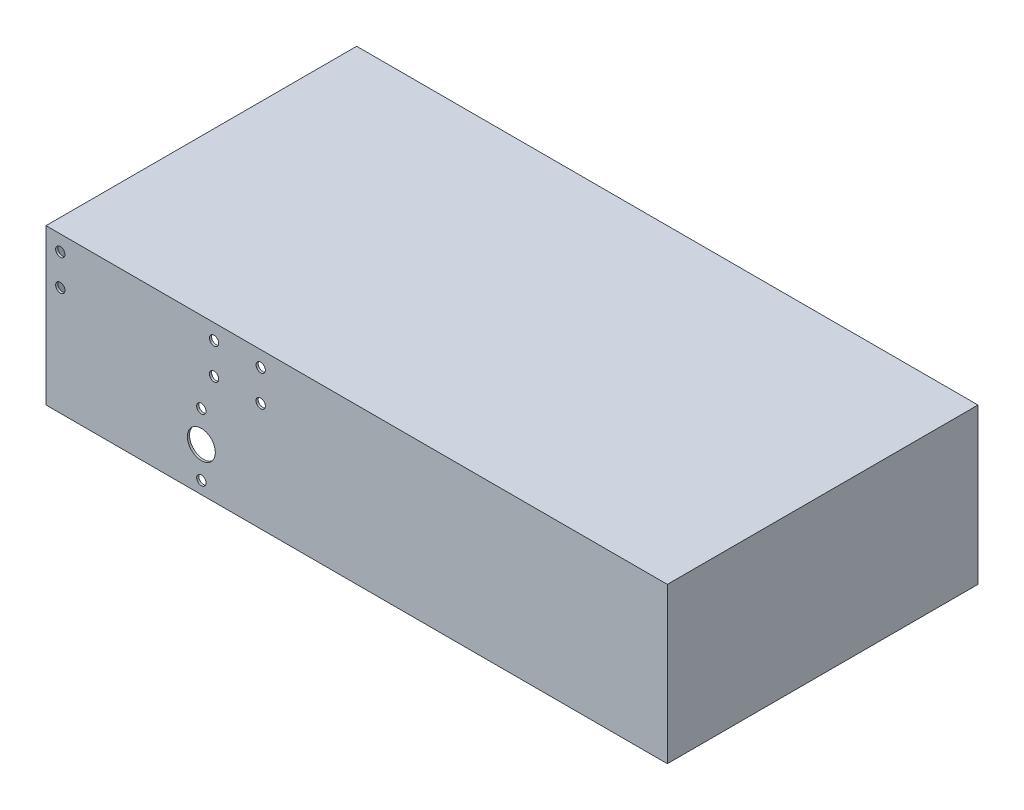
ISO-10303-21;
HEADER;
FILE_DESCRIPTION(('STEP AP214'),'2;1');
FILE_NAME('part.step','',(''),(''),'','','');
FILE_SCHEMA(('AUTOMOTIVE_DESIGN { 1 0 10303 214 1 1 1 1 }'));
ENDSEC;
DATA;
#1=APPLICATION_CONTEXT('core data for automotive mechanical design processes');
#2=APPLICATION_PROTOCOL_DEFINITION('international standard','automotive_design',2000,#1);
#3=PRODUCT_CONTEXT('',#1,'mechanical');
#4=PRODUCT('Part','Part','',(#3));
#5=PRODUCT_RELATED_PRODUCT_CATEGORY('part','',(#4));
#6=PRODUCT_DEFINITION_FORMATION('','',#4);
#7=PRODUCT_DEFINITION_CONTEXT('part definition',#1,'design');
#8=PRODUCT_DEFINITION('design','',#6,#7);
#9=PRODUCT_DEFINITION_SHAPE('','',#8);
#10=(LENGTH_UNIT() NAMED_UNIT(*) SI_UNIT(.MILLI.,.METRE.));
#11=(NAMED_UNIT(*) PLANE_ANGLE_UNIT() SI_UNIT($,.RADIAN.));
#12=(NAMED_UNIT(*) SI_UNIT($,.STERADIAN.) SOLID_ANGLE_UNIT());
#13=UNCERTAINTY_MEASURE_WITH_UNIT(LENGTH_MEASURE(1.E-05),#10,'distance_accuracy_value','');
#14=(GEOMETRIC_REPRESENTATION_CONTEXT(3) GLOBAL_UNCERTAINTY_ASSIGNED_CONTEXT((#13)) GLOBAL_UNIT_ASSIGNED_CONTEXT((#10,
#11,#12)) REPRESENTATION_CONTEXT('',''));
#15=CARTESIAN_POINT('',(0.,0.,0.));
#16=DIRECTION('',(0.,0.,1.));
#17=DIRECTION('',(1.,0.,0.));
#18=AXIS2_PLACEMENT_3D('',#15,#16,#17);
#19=CARTESIAN_POINT('',(0.,50.,-50.));
#20=DIRECTION('',(1.,0.,0.));
#21=DIRECTION('',(0.,0.,-1.));
#22=AXIS2_PLACEMENT_3D('',#19,#20,#21);
#23=PLANE('',#22);
#24=CARTESIAN_POINT('',(0.,45.,42.));
#25=DIRECTION('',(-1.,0.,0.));
#26=DIRECTION('',(0.,0.,1.));
#27=AXIS2_PLACEMENT_3D('',#24,#25,#26);
#28=CIRCLE('',#27,1.5);
#29=CARTESIAN_POINT('',(0.,45.,43.5));
#30=VERTEX_POINT('',#29);
#31=EDGE_CURVE('E293',#30,#30,#28,.T.);
#32=ORIENTED_EDGE('',*,*,#31,.F.);
#33=EDGE_LOOP('',(#32));
#34=FACE_BOUND('',#33,.T.);
#35=CARTESIAN_POINT('',(0.,35.,42.));
#36=DIRECTION('',(-1.,0.,0.));
#37=DIRECTION('',(0.,0.,1.));
#38=AXIS2_PLACEMENT_3D('',#35,#36,#37);
#39=CIRCLE('',#38,1.5);
#40=CARTESIAN_POINT('',(0.,35.,43.5));
#41=VERTEX_POINT('',#40);
#42=EDGE_CURVE('E297',#41,#41,#39,.T.);
#43=ORIENTED_EDGE('',*,*,#42,.F.);
#44=EDGE_LOOP('',(#43));
#45=FACE_BOUND('',#44,.T.);
#46=DIRECTION('',(0.,0.,1.));
#47=VECTOR('',#46,1.);
#48=CARTESIAN_POINT('',(0.,0.,-50.));
#49=LINE('',#48,#47);
#50=CARTESIAN_POINT('',(0.,0.,-50.));
#51=VERTEX_POINT('',#50);
#52=CARTESIAN_POINT('',(0.,0.,50.));
#53=VERTEX_POINT('',#52);
#54=EDGE_CURVE('E193',#51,#53,#49,.T.);
#55=ORIENTED_EDGE('',*,*,#54,.T.);
#56=DIRECTION('',(0.,-1.,0.));
#57=VECTOR('',#56,1.);
#58=CARTESIAN_POINT('',(0.,50.,50.));
#59=LINE('',#58,#57);
#60=CARTESIAN_POINT('',(0.,50.,50.));
#61=VERTEX_POINT('',#60);
#62=EDGE_CURVE('E12',#61,#53,#59,.T.);
#63=ORIENTED_EDGE('',*,*,#62,.F.);
#64=DIRECTION('',(0.,0.,1.));
#65=VECTOR('',#64,1.);
#66=CARTESIAN_POINT('',(0.,50.,-50.));
#67=LINE('',#66,#65);
#68=CARTESIAN_POINT('',(0.,50.,-50.));
#69=VERTEX_POINT('',#68);
#70=EDGE_CURVE('E194',#69,#61,#67,.T.);
#71=ORIENTED_EDGE('',*,*,#70,.F.);
#72=DIRECTION('',(0.,-1.,0.));
#73=VECTOR('',#72,1.);
#74=CARTESIAN_POINT('',(0.,50.,-50.));
#75=LINE('',#74,#73);
#76=EDGE_CURVE('E208',#69,#51,#75,.T.);
#77=ORIENTED_EDGE('',*,*,#76,.T.);
#78=EDGE_LOOP('',(#55,#63,#71,#77));
#79=FACE_BOUND('',#78,.T.);
#80=ADVANCED_FACE('F43',(#34,#45,#79),#23,.F.);
#81=CARTESIAN_POINT('',(0.,50.,50.));
#82=DIRECTION('',(0.,0.,-1.));
#83=DIRECTION('',(-1.,0.,0.));
#84=AXIS2_PLACEMENT_3D('',#81,#82,#83);
#85=PLANE('',#84);
#86=CARTESIAN_POINT('',(4.59999999999999,35.,50.));
#87=DIRECTION('',(0.,0.,1.));
#88=DIRECTION('',(1.,0.,0.));
#89=AXIS2_PLACEMENT_3D('',#86,#87,#88);
#90=CIRCLE('',#89,1.5);
#91=CARTESIAN_POINT('',(6.09999999999999,35.,50.));
#92=VERTEX_POINT('',#91);
#93=EDGE_CURVE('E594',#92,#92,#90,.T.);
#94=ORIENTED_EDGE('',*,*,#93,.F.);
#95=EDGE_LOOP('',(#94));
#96=FACE_BOUND('',#95,.T.);
#97=CARTESIAN_POINT('',(54.1,35.,50.));
#98=DIRECTION('',(0.,0.,1.));
#99=DIRECTION('',(1.,0.,0.));
#100=AXIS2_PLACEMENT_3D('',#97,#98,#99);
#101=CIRCLE('',#100,1.5);
#102=CARTESIAN_POINT('',(55.6,35.,50.));
#103=VERTEX_POINT('',#102);
#104=EDGE_CURVE('E604',#103,#103,#101,.T.);
#105=ORIENTED_EDGE('',*,*,#104,.F.);
#106=EDGE_LOOP('',(#105));
#107=FACE_BOUND('',#106,.T.);
#108=CARTESIAN_POINT('',(54.1,45.,50.));
#109=DIRECTION('',(0.,0.,1.));
#110=DIRECTION('',(1.,0.,0.));
#111=AXIS2_PLACEMENT_3D('',#108,#109,#110);
#112=CIRCLE('',#111,1.5);
#113=CARTESIAN_POINT('',(55.6,45.,50.));
#114=VERTEX_POINT('',#113);
#115=EDGE_CURVE('E612',#114,#114,#112,.T.);
#116=ORIENTED_EDGE('',*,*,#115,.F.);
#117=EDGE_LOOP('',(#116));
#118=FACE_BOUND('',#117,.T.);
#119=CARTESIAN_POINT('',(69.1,45.,50.));
#120=DIRECTION('',(0.,0.,1.));
#121=DIRECTION('',(1.,0.,0.));
#122=AXIS2_PLACEMENT_3D('',#119,#120,#121);
#123=CIRCLE('',#122,1.5);
#124=CARTESIAN_POINT('',(70.6,45.,50.));
#125=VERTEX_POINT('',#124);
#126=EDGE_CURVE('E593',#125,#125,#123,.T.);
#127=ORIENTED_EDGE('',*,*,#126,.F.);
#128=EDGE_LOOP('',(#127));
#129=FACE_BOUND('',#128,.T.);
#130=CARTESIAN_POINT('',(69.1,35.,50.));
#131=DIRECTION('',(0.,0.,1.));
#132=DIRECTION('',(1.,0.,0.));
#133=AXIS2_PLACEMENT_3D('',#130,#131,#132);
#134=CIRCLE('',#133,1.5);
#135=CARTESIAN_POINT('',(70.6,35.,50.));
#136=VERTEX_POINT('',#135);
#137=EDGE_CURVE('E580',#136,#136,#134,.T.);
#138=ORIENTED_EDGE('',*,*,#137,.F.);
#139=EDGE_LOOP('',(#138));
#140=FACE_BOUND('',#139,.T.);
#141=CARTESIAN_POINT('',(4.59999999999999,45.,50.));
#142=DIRECTION('',(0.,0.,1.));
#143=DIRECTION('',(1.,0.,0.));
#144=AXIS2_PLACEMENT_3D('',#141,#142,#143);
#145=CIRCLE('',#144,1.5);
#146=CARTESIAN_POINT('',(6.09999999999999,45.,50.));
#147=VERTEX_POINT('',#146);
#148=EDGE_CURVE('E603',#147,#147,#145,.T.);
#149=ORIENTED_EDGE('',*,*,#148,.F.);
#150=EDGE_LOOP('',(#149));
#151=FACE_BOUND('',#150,.T.);
#152=CARTESIAN_POINT('',(50.,4.,50.));
#153=DIRECTION('',(0.,0.,1.));
#154=DIRECTION('',(1.,0.,0.));
#155=AXIS2_PLACEMENT_3D('',#152,#153,#154);
#156=CIRCLE('',#155,1.5);
#157=CARTESIAN_POINT('',(51.5,4.,50.));
#158=VERTEX_POINT('',#157);
#159=EDGE_CURVE('E636',#158,#158,#156,.T.);
#160=ORIENTED_EDGE('',*,*,#159,.F.);
#161=EDGE_LOOP('',(#160));
#162=FACE_BOUND('',#161,.T.);
#163=CARTESIAN_POINT('',(50.,24.,50.));
#164=DIRECTION('',(0.,0.,1.));
#165=DIRECTION('',(1.,0.,0.));
#166=AXIS2_PLACEMENT_3D('',#163,#164,#165);
#167=CIRCLE('',#166,1.5);
#168=CARTESIAN_POINT('',(51.5,24.,50.));
#169=VERTEX_POINT('',#168);
#170=EDGE_CURVE('E644',#169,#169,#167,.T.);
#171=ORIENTED_EDGE('',*,*,#170,.F.);
#172=EDGE_LOOP('',(#171));
#173=FACE_BOUND('',#172,.T.);
#174=CARTESIAN_POINT('',(50.,14.,50.));
#175=DIRECTION('',(0.,0.,1.));
#176=DIRECTION('',(1.,0.,0.));
#177=AXIS2_PLACEMENT_3D('',#174,#175,#176);
#178=CIRCLE('',#177,4.5);
#179=CARTESIAN_POINT('',(54.5,14.,50.));
#180=VERTEX_POINT('',#179);
#181=EDGE_CURVE('E250',#180,#180,#178,.T.);
#182=ORIENTED_EDGE('',*,*,#181,.F.);
#183=EDGE_LOOP('',(#182));
#184=FACE_BOUND('',#183,.T.);
#185=DIRECTION('',(1.,0.,0.));
#186=VECTOR('',#185,1.);
#187=CARTESIAN_POINT('',(0.,0.,50.));
#188=LINE('',#187,#186);
#189=CARTESIAN_POINT('',(200.,0.,50.));
#190=VERTEX_POINT('',#189);
#191=EDGE_CURVE('E212',#53,#190,#188,.T.);
#192=ORIENTED_EDGE('',*,*,#191,.T.);
#193=DIRECTION('',(0.,-1.,0.));
#194=VECTOR('',#193,1.);
#195=CARTESIAN_POINT('',(200.,50.,50.));
#196=LINE('',#195,#194);
#197=CARTESIAN_POINT('',(200.,50.,50.));
#198=VERTEX_POINT('',#197);
#199=EDGE_CURVE('E52',#198,#190,#196,.T.);
#200=ORIENTED_EDGE('',*,*,#199,.F.);
#201=DIRECTION('',(1.,0.,0.));
#202=VECTOR('',#201,1.);
#203=CARTESIAN_POINT('',(0.,50.,50.));
#204=LINE('',#203,#202);
#205=EDGE_CURVE('E198',#61,#198,#204,.T.);
#206=ORIENTED_EDGE('',*,*,#205,.F.);
#207=ORIENTED_EDGE('',*,*,#62,.T.);
#208=EDGE_LOOP('',(#192,#200,#206,#207));
#209=FACE_BOUND('',#208,.T.);
#210=ADVANCED_FACE('F283',(#96,#107,#118,#129,#140,#151,#162,#173,#184,#209),#85,.F.);
#211=CARTESIAN_POINT('',(200.,50.,-50.));
#212=DIRECTION('',(-1.,0.,0.));
#213=DIRECTION('',(0.,0.,1.));
#214=AXIS2_PLACEMENT_3D('',#211,#212,#213);
#215=PLANE('',#214);
#216=DIRECTION('',(0.,0.,-1.));
#217=VECTOR('',#216,1.);
#218=CARTESIAN_POINT('',(200.,0.,-50.));
#219=LINE('',#218,#217);
#220=CARTESIAN_POINT('',(200.,0.,-50.));
#221=VERTEX_POINT('',#220);
#222=EDGE_CURVE('E215',#190,#221,#219,.T.);
#223=ORIENTED_EDGE('',*,*,#222,.T.);
#224=DIRECTION('',(0.,-1.,0.));
#225=VECTOR('',#224,1.);
#226=CARTESIAN_POINT('',(200.,50.,-50.));
#227=LINE('',#226,#225);
#228=CARTESIAN_POINT('',(200.,50.,-50.));
#229=VERTEX_POINT('',#228);
#230=EDGE_CURVE('E223',#229,#221,#227,.T.);
#231=ORIENTED_EDGE('',*,*,#230,.F.);
#232=DIRECTION('',(0.,0.,-1.));
#233=VECTOR('',#232,1.);
#234=CARTESIAN_POINT('',(200.,50.,-50.));
#235=LINE('',#234,#233);
#236=EDGE_CURVE('E202',#198,#229,#235,.T.);
#237=ORIENTED_EDGE('',*,*,#236,.F.);
#238=ORIENTED_EDGE('',*,*,#199,.T.);
#239=EDGE_LOOP('',(#223,#231,#237,#238));
#240=FACE_BOUND('',#239,.T.);
#241=ADVANCED_FACE('F288',(#240),#215,.F.);
#242=CARTESIAN_POINT('',(0.,50.,-50.));
#243=DIRECTION('',(0.,0.,1.));
#244=DIRECTION('',(1.,0.,0.));
#245=AXIS2_PLACEMENT_3D('',#242,#243,#244);
#246=PLANE('',#245);
#247=CARTESIAN_POINT('',(50.,4.,-50.));
#248=DIRECTION('',(0.,0.,1.));
#249=DIRECTION('',(1.,0.,0.));
#250=AXIS2_PLACEMENT_3D('',#247,#248,#249);
#251=CIRCLE('',#250,1.5);
#252=CARTESIAN_POINT('',(51.5,4.,-50.));
#253=VERTEX_POINT('',#252);
#254=EDGE_CURVE('E234',#253,#253,#251,.T.);
#255=ORIENTED_EDGE('',*,*,#254,.T.);
#256=EDGE_LOOP('',(#255));
#257=FACE_BOUND('',#256,.T.);
#258=CARTESIAN_POINT('',(50.,24.,-50.));
#259=DIRECTION('',(0.,0.,1.));
#260=DIRECTION('',(1.,0.,0.));
#261=AXIS2_PLACEMENT_3D('',#258,#259,#260);
#262=CIRCLE('',#261,1.5);
#263=CARTESIAN_POINT('',(51.5,24.,-50.));
#264=VERTEX_POINT('',#263);
#265=EDGE_CURVE('E640',#264,#264,#262,.T.);
#266=ORIENTED_EDGE('',*,*,#265,.T.);
#267=EDGE_LOOP('',(#266));
#268=FACE_BOUND('',#267,.T.);
#269=CARTESIAN_POINT('',(50.,14.,-50.));
#270=DIRECTION('',(0.,0.,1.));
#271=DIRECTION('',(1.,0.,0.));
#272=AXIS2_PLACEMENT_3D('',#269,#270,#271);
#273=CIRCLE('',#272,4.5);
#274=CARTESIAN_POINT('',(54.5,14.,-50.));
#275=VERTEX_POINT('',#274);
#276=EDGE_CURVE('E647',#275,#275,#273,.T.);
#277=ORIENTED_EDGE('',*,*,#276,.T.);
#278=EDGE_LOOP('',(#277));
#279=FACE_BOUND('',#278,.T.);
#280=DIRECTION('',(-1.,0.,0.));
#281=VECTOR('',#280,1.);
#282=CARTESIAN_POINT('',(0.,0.,-50.));
#283=LINE('',#282,#281);
#284=EDGE_CURVE('E199',#221,#51,#283,.T.);
#285=ORIENTED_EDGE('',*,*,#284,.T.);
#286=ORIENTED_EDGE('',*,*,#76,.F.);
#287=DIRECTION('',(-1.,0.,0.));
#288=VECTOR('',#287,1.);
#289=CARTESIAN_POINT('',(0.,50.,-50.));
#290=LINE('',#289,#288);
#291=EDGE_CURVE('E205',#229,#69,#290,.T.);
#292=ORIENTED_EDGE('',*,*,#291,.F.);
#293=ORIENTED_EDGE('',*,*,#230,.T.);
#294=EDGE_LOOP('',(#285,#286,#292,#293));
#295=FACE_BOUND('',#294,.T.);
#296=ADVANCED_FACE('F312',(#257,#268,#279,#295),#246,.F.);
#297=CARTESIAN_POINT('',(0.,50.,0.));
#298=DIRECTION('',(0.,1.,0.));
#299=DIRECTION('',(0.,0.,1.));
#300=AXIS2_PLACEMENT_3D('',#297,#298,#299);
#301=PLANE('',#300);
#302=ORIENTED_EDGE('',*,*,#70,.T.);
#303=ORIENTED_EDGE('',*,*,#205,.T.);
#304=ORIENTED_EDGE('',*,*,#236,.T.);
#305=ORIENTED_EDGE('',*,*,#291,.T.);
#306=EDGE_LOOP('',(#302,#303,#304,#305));
#307=FACE_BOUND('',#306,.T.);
#308=ADVANCED_FACE('F308',(#307),#301,.T.);
#309=CARTESIAN_POINT('',(0.,0.,0.));
#310=DIRECTION('',(0.,1.,0.));
#311=DIRECTION('',(0.,0.,1.));
#312=AXIS2_PLACEMENT_3D('',#309,#310,#311);
#313=PLANE('',#312);
#314=CARTESIAN_POINT('',(160.,0.,-7.05));
#315=DIRECTION('',(0.,-1.,0.));
#316=DIRECTION('',(0.,0.,-1.));
#317=AXIS2_PLACEMENT_3D('',#314,#315,#316);
#318=CIRCLE('',#317,1.21);
#319=CARTESIAN_POINT('',(160.,0.,-8.26));
#320=VERTEX_POINT('',#319);
#321=EDGE_CURVE('E569',#320,#320,#318,.T.);
#322=ORIENTED_EDGE('',*,*,#321,.F.);
#323=EDGE_LOOP('',(#322));
#324=FACE_BOUND('',#323,.T.);
#325=CARTESIAN_POINT('',(160.,0.,8.45));
#326=DIRECTION('',(0.,-1.,0.));
#327=DIRECTION('',(0.,0.,-1.));
#328=AXIS2_PLACEMENT_3D('',#325,#326,#327);
#329=CIRCLE('',#328,1.21);
#330=CARTESIAN_POINT('',(160.,0.,7.24));
#331=VERTEX_POINT('',#330);
#332=EDGE_CURVE('E565',#331,#331,#329,.T.);
#333=ORIENTED_EDGE('',*,*,#332,.F.);
#334=EDGE_LOOP('',(#333));
#335=FACE_BOUND('',#334,.T.);
#336=DIRECTION('',(1.,0.,0.));
#337=VECTOR('',#336,1.);
#338=CARTESIAN_POINT('',(0.700000000000012,0.,-49.3));
#339=LINE('',#338,#337);
#340=CARTESIAN_POINT('',(0.700000000000012,0.,-49.3));
#341=VERTEX_POINT('',#340);
#342=CARTESIAN_POINT('',(145.,0.,-49.3));
#343=VERTEX_POINT('',#342);
#344=EDGE_CURVE('E65',#341,#343,#339,.T.);
#345=ORIENTED_EDGE('',*,*,#344,.F.);
#346=DIRECTION('',(0.,0.,-1.));
#347=VECTOR('',#346,1.);
#348=CARTESIAN_POINT('',(0.7,0.,49.3));
#349=LINE('',#348,#347);
#350=CARTESIAN_POINT('',(0.7,0.,49.3));
#351=VERTEX_POINT('',#350);
#352=EDGE_CURVE('E127',#351,#341,#349,.T.);
#353=ORIENTED_EDGE('',*,*,#352,.F.);
#354=DIRECTION('',(-1.,0.,0.));
#355=VECTOR('',#354,1.);
#356=CARTESIAN_POINT('',(199.3,0.,49.3));
#357=LINE('',#356,#355);
#358=CARTESIAN_POINT('',(145.,0.,49.3));
#359=VERTEX_POINT('',#358);
#360=EDGE_CURVE('E120',#359,#351,#357,.T.);
#361=ORIENTED_EDGE('',*,*,#360,.F.);
#362=DIRECTION('',(0.,0.,-1.));
#363=VECTOR('',#362,1.);
#364=CARTESIAN_POINT('',(145.,0.,-49.3));
#365=LINE('',#364,#363);
#366=EDGE_CURVE('E125',#359,#343,#365,.T.);
#367=ORIENTED_EDGE('',*,*,#366,.T.);
#368=EDGE_LOOP('',(#345,#353,#361,#367));
#369=FACE_BOUND('',#368,.T.);
#370=ORIENTED_EDGE('',*,*,#54,.F.);
#371=ORIENTED_EDGE('',*,*,#284,.F.);
#372=ORIENTED_EDGE('',*,*,#222,.F.);
#373=ORIENTED_EDGE('',*,*,#191,.F.);
#374=EDGE_LOOP('',(#370,#371,#372,#373));
#375=FACE_BOUND('',#374,.T.);
#376=ADVANCED_FACE('F122',(#324,#335,#369,#375),#313,.F.);
#377=CARTESIAN_POINT('',(0.,49.3,0.));
#378=DIRECTION('',(0.,1.,0.));
#379=DIRECTION('',(0.,0.,1.));
#380=AXIS2_PLACEMENT_3D('',#377,#378,#379);
#381=PLANE('',#380);
#382=DIRECTION('',(-1.,0.,0.));
#383=VECTOR('',#382,1.);
#384=CARTESIAN_POINT('',(199.3,49.3,49.3));
#385=LINE('',#384,#383);
#386=CARTESIAN_POINT('',(199.3,49.3,49.3));
#387=VERTEX_POINT('',#386);
#388=CARTESIAN_POINT('',(0.7,49.3,49.3));
#389=VERTEX_POINT('',#388);
#390=EDGE_CURVE('E169',#387,#389,#385,.T.);
#391=ORIENTED_EDGE('',*,*,#390,.T.);
#392=DIRECTION('',(0.,0.,-1.));
#393=VECTOR('',#392,1.);
#394=CARTESIAN_POINT('',(0.7,49.3,49.3));
#395=LINE('',#394,#393);
#396=CARTESIAN_POINT('',(0.700000000000012,49.3,-49.3));
#397=VERTEX_POINT('',#396);
#398=EDGE_CURVE('E162',#389,#397,#395,.T.);
#399=ORIENTED_EDGE('',*,*,#398,.T.);
#400=DIRECTION('',(1.,0.,0.));
#401=VECTOR('',#400,1.);
#402=CARTESIAN_POINT('',(0.700000000000012,49.3,-49.3));
#403=LINE('',#402,#401);
#404=CARTESIAN_POINT('',(199.3,49.3,-49.3));
#405=VERTEX_POINT('',#404);
#406=EDGE_CURVE('E180',#397,#405,#403,.T.);
#407=ORIENTED_EDGE('',*,*,#406,.T.);
#408=DIRECTION('',(0.,0.,1.));
#409=VECTOR('',#408,1.);
#410=CARTESIAN_POINT('',(199.3,49.3,-49.3));
#411=LINE('',#410,#409);
#412=EDGE_CURVE('E175',#405,#387,#411,.T.);
#413=ORIENTED_EDGE('',*,*,#412,.T.);
#414=EDGE_LOOP('',(#391,#399,#407,#413));
#415=FACE_BOUND('',#414,.T.);
#416=ADVANCED_FACE('F267',(#415),#381,.F.);
#417=CARTESIAN_POINT('',(0.7,271.729384611061,49.3));
#418=DIRECTION('',(-1.,0.,0.));
#419=DIRECTION('',(0.,0.,1.));
#420=AXIS2_PLACEMENT_3D('',#417,#418,#419);
#421=PLANE('',#420);
#422=CARTESIAN_POINT('',(0.700000000000001,45.,42.));
#423=DIRECTION('',(-1.,0.,0.));
#424=DIRECTION('',(0.,0.,1.));
#425=AXIS2_PLACEMENT_3D('',#422,#423,#424);
#426=CIRCLE('',#425,1.5);
#427=CARTESIAN_POINT('',(0.700000000000001,45.,43.5));
#428=VERTEX_POINT('',#427);
#429=EDGE_CURVE('E575',#428,#428,#426,.F.);
#430=ORIENTED_EDGE('',*,*,#429,.F.);
#431=EDGE_LOOP('',(#430));
#432=FACE_BOUND('',#431,.T.);
#433=CARTESIAN_POINT('',(0.700000000000001,35.,42.));
#434=DIRECTION('',(-1.,0.,0.));
#435=DIRECTION('',(0.,0.,1.));
#436=AXIS2_PLACEMENT_3D('',#433,#434,#435);
#437=CIRCLE('',#436,1.5);
#438=CARTESIAN_POINT('',(0.700000000000001,35.,43.5));
#439=VERTEX_POINT('',#438);
#440=EDGE_CURVE('E576',#439,#439,#437,.F.);
#441=ORIENTED_EDGE('',*,*,#440,.F.);
#442=EDGE_LOOP('',(#441));
#443=FACE_BOUND('',#442,.T.);
#444=DIRECTION('',(0.,-1.,0.));
#445=VECTOR('',#444,1.);
#446=CARTESIAN_POINT('',(0.7,271.729384611061,49.3));
#447=LINE('',#446,#445);
#448=EDGE_CURVE('E173',#389,#351,#447,.T.);
#449=ORIENTED_EDGE('',*,*,#448,.T.);
#450=ORIENTED_EDGE('',*,*,#352,.T.);
#451=DIRECTION('',(0.,-1.,0.));
#452=VECTOR('',#451,1.);
#453=CARTESIAN_POINT('',(0.700000000000012,271.729384611061,-49.3));
#454=LINE('',#453,#452);
#455=EDGE_CURVE('E168',#397,#341,#454,.T.);
#456=ORIENTED_EDGE('',*,*,#455,.F.);
#457=ORIENTED_EDGE('',*,*,#398,.F.);
#458=EDGE_LOOP('',(#449,#450,#456,#457));
#459=FACE_BOUND('',#458,.T.);
#460=ADVANCED_FACE('F269',(#432,#443,#459),#421,.F.);
#461=CARTESIAN_POINT('',(0.700000000000012,271.729384611061,-49.3));
#462=DIRECTION('',(0.,0.,-1.));
#463=DIRECTION('',(-1.,0.,0.));
#464=AXIS2_PLACEMENT_3D('',#461,#462,#463);
#465=PLANE('',#464);
#466=CARTESIAN_POINT('',(50.,4.,-49.3));
#467=DIRECTION('',(0.,0.,-1.));
#468=DIRECTION('',(-1.,0.,0.));
#469=AXIS2_PLACEMENT_3D('',#466,#467,#468);
#470=CIRCLE('',#469,1.5);
#471=CARTESIAN_POINT('',(48.5,4.,-49.3));
#472=VERTEX_POINT('',#471);
#473=EDGE_CURVE('E147',#472,#472,#470,.T.);
#474=ORIENTED_EDGE('',*,*,#473,.T.);
#475=EDGE_LOOP('',(#474));
#476=FACE_BOUND('',#475,.T.);
#477=CARTESIAN_POINT('',(50.,24.,-49.3));
#478=DIRECTION('',(0.,0.,-1.));
#479=DIRECTION('',(-1.,0.,0.));
#480=AXIS2_PLACEMENT_3D('',#477,#478,#479);
#481=CIRCLE('',#480,1.5);
#482=CARTESIAN_POINT('',(48.5,24.,-49.3));
#483=VERTEX_POINT('',#482);
#484=EDGE_CURVE('E238',#483,#483,#481,.T.);
#485=ORIENTED_EDGE('',*,*,#484,.T.);
#486=EDGE_LOOP('',(#485));
#487=FACE_BOUND('',#486,.T.);
#488=CARTESIAN_POINT('',(50.,14.,-49.3));
#489=DIRECTION('',(0.,0.,-1.));
#490=DIRECTION('',(-1.,0.,0.));
#491=AXIS2_PLACEMENT_3D('',#488,#489,#490);
#492=CIRCLE('',#491,4.5);
#493=CARTESIAN_POINT('',(45.5,14.,-49.3));
#494=VERTEX_POINT('',#493);
#495=EDGE_CURVE('E233',#494,#494,#492,.T.);
#496=ORIENTED_EDGE('',*,*,#495,.T.);
#497=EDGE_LOOP('',(#496));
#498=FACE_BOUND('',#497,.T.);
#499=ORIENTED_EDGE('',*,*,#344,.T.);
#500=DIRECTION('',(0.,-1.,0.));
#501=VECTOR('',#500,1.);
#502=CARTESIAN_POINT('',(145.,0.7,-49.3));
#503=LINE('',#502,#501);
#504=CARTESIAN_POINT('',(145.,0.699999999999978,-49.3));
#505=VERTEX_POINT('',#504);
#506=EDGE_CURVE('E60',#505,#343,#503,.T.);
#507=ORIENTED_EDGE('',*,*,#506,.F.);
#508=DIRECTION('',(1.,0.,0.));
#509=VECTOR('',#508,1.);
#510=CARTESIAN_POINT('',(145.,0.7,-49.3));
#511=LINE('',#510,#509);
#512=CARTESIAN_POINT('',(199.3,0.699999999999978,-49.3));
#513=VERTEX_POINT('',#512);
#514=EDGE_CURVE('E151',#505,#513,#511,.T.);
#515=ORIENTED_EDGE('',*,*,#514,.T.);
#516=DIRECTION('',(0.,-1.,0.));
#517=VECTOR('',#516,1.);
#518=CARTESIAN_POINT('',(199.3,271.729384611061,-49.3));
#519=LINE('',#518,#517);
#520=EDGE_CURVE('E179',#405,#513,#519,.T.);
#521=ORIENTED_EDGE('',*,*,#520,.F.);
#522=ORIENTED_EDGE('',*,*,#406,.F.);
#523=ORIENTED_EDGE('',*,*,#455,.T.);
#524=EDGE_LOOP('',(#499,#507,#515,#521,#522,#523));
#525=FACE_BOUND('',#524,.T.);
#526=ADVANCED_FACE('F264',(#476,#487,#498,#525),#465,.F.);
#527=CARTESIAN_POINT('',(199.3,271.729384611061,-49.3));
#528=DIRECTION('',(1.,0.,0.));
#529=DIRECTION('',(0.,0.,-1.));
#530=AXIS2_PLACEMENT_3D('',#527,#528,#529);
#531=PLANE('',#530);
#532=ORIENTED_EDGE('',*,*,#520,.T.);
#533=DIRECTION('',(0.,0.,1.));
#534=VECTOR('',#533,1.);
#535=CARTESIAN_POINT('',(199.3,0.7,-49.3));
#536=LINE('',#535,#534);
#537=CARTESIAN_POINT('',(199.3,0.699999999999978,49.3));
#538=VERTEX_POINT('',#537);
#539=EDGE_CURVE('E254',#513,#538,#536,.T.);
#540=ORIENTED_EDGE('',*,*,#539,.T.);
#541=DIRECTION('',(0.,-1.,0.));
#542=VECTOR('',#541,1.);
#543=CARTESIAN_POINT('',(199.3,271.729384611061,49.3));
#544=LINE('',#543,#542);
#545=EDGE_CURVE('E174',#387,#538,#544,.T.);
#546=ORIENTED_EDGE('',*,*,#545,.F.);
#547=ORIENTED_EDGE('',*,*,#412,.F.);
#548=EDGE_LOOP('',(#532,#540,#546,#547));
#549=FACE_BOUND('',#548,.T.);
#550=ADVANCED_FACE('F260',(#549),#531,.F.);
#551=CARTESIAN_POINT('',(199.3,271.729384611061,49.3));
#552=DIRECTION('',(0.,0.,1.));
#553=DIRECTION('',(1.,0.,0.));
#554=AXIS2_PLACEMENT_3D('',#551,#552,#553);
#555=PLANE('',#554);
#556=CARTESIAN_POINT('',(4.59999999999999,35.,49.3));
#557=DIRECTION('',(0.,0.,1.));
#558=DIRECTION('',(1.,0.,0.));
#559=AXIS2_PLACEMENT_3D('',#556,#557,#558);
#560=CIRCLE('',#559,1.5);
#561=CARTESIAN_POINT('',(6.09999999999999,35.,49.3));
#562=VERTEX_POINT('',#561);
#563=EDGE_CURVE('E598',#562,#562,#560,.F.);
#564=ORIENTED_EDGE('',*,*,#563,.F.);
#565=EDGE_LOOP('',(#564));
#566=FACE_BOUND('',#565,.T.);
#567=CARTESIAN_POINT('',(54.1,35.,49.3));
#568=DIRECTION('',(0.,0.,1.));
#569=DIRECTION('',(1.,0.,0.));
#570=AXIS2_PLACEMENT_3D('',#567,#568,#569);
#571=CIRCLE('',#570,1.5);
#572=CARTESIAN_POINT('',(55.6,35.,49.3));
#573=VERTEX_POINT('',#572);
#574=EDGE_CURVE('E599',#573,#573,#571,.F.);
#575=ORIENTED_EDGE('',*,*,#574,.F.);
#576=EDGE_LOOP('',(#575));
#577=FACE_BOUND('',#576,.T.);
#578=CARTESIAN_POINT('',(54.1,45.,49.3));
#579=DIRECTION('',(0.,0.,1.));
#580=DIRECTION('',(1.,0.,0.));
#581=AXIS2_PLACEMENT_3D('',#578,#579,#580);
#582=CIRCLE('',#581,1.5);
#583=CARTESIAN_POINT('',(55.6,45.,49.3));
#584=VERTEX_POINT('',#583);
#585=EDGE_CURVE('E608',#584,#584,#582,.F.);
#586=ORIENTED_EDGE('',*,*,#585,.F.);
#587=EDGE_LOOP('',(#586));
#588=FACE_BOUND('',#587,.T.);
#589=CARTESIAN_POINT('',(69.1,45.,49.3));
#590=DIRECTION('',(0.,0.,1.));
#591=DIRECTION('',(1.,0.,0.));
#592=AXIS2_PLACEMENT_3D('',#589,#590,#591);
#593=CIRCLE('',#592,1.5);
#594=CARTESIAN_POINT('',(70.6,45.,49.3));
#595=VERTEX_POINT('',#594);
#596=EDGE_CURVE('E616',#595,#595,#593,.F.);
#597=ORIENTED_EDGE('',*,*,#596,.F.);
#598=EDGE_LOOP('',(#597));
#599=FACE_BOUND('',#598,.T.);
#600=CARTESIAN_POINT('',(69.1,35.,49.3));
#601=DIRECTION('',(0.,0.,1.));
#602=DIRECTION('',(1.,0.,0.));
#603=AXIS2_PLACEMENT_3D('',#600,#601,#602);
#604=CIRCLE('',#603,1.5);
#605=CARTESIAN_POINT('',(70.6,35.,49.3));
#606=VERTEX_POINT('',#605);
#607=EDGE_CURVE('E589',#606,#606,#604,.F.);
#608=ORIENTED_EDGE('',*,*,#607,.F.);
#609=EDGE_LOOP('',(#608));
#610=FACE_BOUND('',#609,.T.);
#611=CARTESIAN_POINT('',(4.59999999999999,45.,49.3));
#612=DIRECTION('',(0.,0.,1.));
#613=DIRECTION('',(1.,0.,0.));
#614=AXIS2_PLACEMENT_3D('',#611,#612,#613);
#615=CIRCLE('',#614,1.5);
#616=CARTESIAN_POINT('',(6.09999999999999,45.,49.3));
#617=VERTEX_POINT('',#616);
#618=EDGE_CURVE('E629',#617,#617,#615,.F.);
#619=ORIENTED_EDGE('',*,*,#618,.F.);
#620=EDGE_LOOP('',(#619));
#621=FACE_BOUND('',#620,.T.);
#622=CARTESIAN_POINT('',(50.,4.,49.3));
#623=DIRECTION('',(0.,0.,1.));
#624=DIRECTION('',(1.,0.,0.));
#625=AXIS2_PLACEMENT_3D('',#622,#623,#624);
#626=CIRCLE('',#625,1.5);
#627=CARTESIAN_POINT('',(51.5,4.,49.3));
#628=VERTEX_POINT('',#627);
#629=EDGE_CURVE('E46',#628,#628,#626,.T.);
#630=ORIENTED_EDGE('',*,*,#629,.T.);
#631=EDGE_LOOP('',(#630));
#632=FACE_BOUND('',#631,.T.);
#633=CARTESIAN_POINT('',(50.,24.,49.3));
#634=DIRECTION('',(0.,0.,1.));
#635=DIRECTION('',(1.,0.,0.));
#636=AXIS2_PLACEMENT_3D('',#633,#634,#635);
#637=CIRCLE('',#636,1.5);
#638=CARTESIAN_POINT('',(51.5,24.,49.3));
#639=VERTEX_POINT('',#638);
#640=EDGE_CURVE('E235',#639,#639,#637,.T.);
#641=ORIENTED_EDGE('',*,*,#640,.T.);
#642=EDGE_LOOP('',(#641));
#643=FACE_BOUND('',#642,.T.);
#644=CARTESIAN_POINT('',(50.,14.,49.3));
#645=DIRECTION('',(0.,0.,1.));
#646=DIRECTION('',(1.,0.,0.));
#647=AXIS2_PLACEMENT_3D('',#644,#645,#646);
#648=CIRCLE('',#647,4.5);
#649=CARTESIAN_POINT('',(54.5,14.,49.3));
#650=VERTEX_POINT('',#649);
#651=EDGE_CURVE('E230',#650,#650,#648,.T.);
#652=ORIENTED_EDGE('',*,*,#651,.T.);
#653=EDGE_LOOP('',(#652));
#654=FACE_BOUND('',#653,.T.);
#655=DIRECTION('',(-1.,0.,0.));
#656=VECTOR('',#655,1.);
#657=CARTESIAN_POINT('',(145.,0.7,49.3));
#658=LINE('',#657,#656);
#659=CARTESIAN_POINT('',(145.,0.699999999999978,49.3));
#660=VERTEX_POINT('',#659);
#661=EDGE_CURVE('E138',#538,#660,#658,.T.);
#662=ORIENTED_EDGE('',*,*,#661,.T.);
#663=DIRECTION('',(0.,-1.,0.));
#664=VECTOR('',#663,1.);
#665=CARTESIAN_POINT('',(145.,0.7,49.3));
#666=LINE('',#665,#664);
#667=EDGE_CURVE('E132',#660,#359,#666,.T.);
#668=ORIENTED_EDGE('',*,*,#667,.T.);
#669=ORIENTED_EDGE('',*,*,#360,.T.);
#670=ORIENTED_EDGE('',*,*,#448,.F.);
#671=ORIENTED_EDGE('',*,*,#390,.F.);
#672=ORIENTED_EDGE('',*,*,#545,.T.);
#673=EDGE_LOOP('',(#662,#668,#669,#670,#671,#672));
#674=FACE_BOUND('',#673,.T.);
#675=ADVANCED_FACE('F135',(#566,#577,#588,#599,#610,#621,#632,#643,#654,#674),#555,.F.);
#676=CARTESIAN_POINT('',(145.,0.7,-49.3));
#677=DIRECTION('',(-1.,0.,0.));
#678=DIRECTION('',(0.,0.,1.));
#679=AXIS2_PLACEMENT_3D('',#676,#677,#678);
#680=PLANE('',#679);
#681=ORIENTED_EDGE('',*,*,#366,.F.);
#682=ORIENTED_EDGE('',*,*,#667,.F.);
#683=DIRECTION('',(0.,0.,-1.));
#684=VECTOR('',#683,1.);
#685=CARTESIAN_POINT('',(145.,0.7,-49.3));
#686=LINE('',#685,#684);
#687=EDGE_CURVE('E146',#660,#505,#686,.T.);
#688=ORIENTED_EDGE('',*,*,#687,.T.);
#689=ORIENTED_EDGE('',*,*,#506,.T.);
#690=EDGE_LOOP('',(#681,#682,#688,#689));
#691=FACE_BOUND('',#690,.T.);
#692=ADVANCED_FACE('F144',(#691),#680,.T.);
#693=CARTESIAN_POINT('',(0.,0.7,0.));
#694=DIRECTION('',(0.,1.,0.));
#695=DIRECTION('',(0.,0.,1.));
#696=AXIS2_PLACEMENT_3D('',#693,#694,#695);
#697=PLANE('',#696);
#698=CARTESIAN_POINT('',(160.,0.699999999999999,-7.05));
#699=DIRECTION('',(0.,1.,0.));
#700=DIRECTION('',(0.,0.,1.));
#701=AXIS2_PLACEMENT_3D('',#698,#699,#700);
#702=CIRCLE('',#701,1.21);
#703=CARTESIAN_POINT('',(160.,0.699999999999999,-5.84000000000001));
#704=VERTEX_POINT('',#703);
#705=EDGE_CURVE('E560',#704,#704,#702,.F.);
#706=ORIENTED_EDGE('',*,*,#705,.T.);
#707=EDGE_LOOP('',(#706));
#708=FACE_BOUND('',#707,.T.);
#709=CARTESIAN_POINT('',(160.,0.699999999999999,8.45));
#710=DIRECTION('',(0.,1.,0.));
#711=DIRECTION('',(0.,0.,1.));
#712=AXIS2_PLACEMENT_3D('',#709,#710,#711);
#713=CIRCLE('',#712,1.21);
#714=CARTESIAN_POINT('',(160.,0.699999999999999,9.65999999999999));
#715=VERTEX_POINT('',#714);
#716=EDGE_CURVE('E563',#715,#715,#713,.F.);
#717=ORIENTED_EDGE('',*,*,#716,.T.);
#718=EDGE_LOOP('',(#717));
#719=FACE_BOUND('',#718,.T.);
#720=ORIENTED_EDGE('',*,*,#687,.F.);
#721=ORIENTED_EDGE('',*,*,#661,.F.);
#722=ORIENTED_EDGE('',*,*,#539,.F.);
#723=ORIENTED_EDGE('',*,*,#514,.F.);
#724=EDGE_LOOP('',(#720,#721,#722,#723));
#725=FACE_BOUND('',#724,.T.);
#726=ADVANCED_FACE('F263',(#708,#719,#725),#697,.T.);
#727=CARTESIAN_POINT('',(50.,14.,-50.));
#728=DIRECTION('',(0.,0.,1.));
#729=DIRECTION('',(1.,0.,0.));
#730=AXIS2_PLACEMENT_3D('',#727,#728,#729);
#731=CYLINDRICAL_SURFACE('',#730,4.5);
#732=ORIENTED_EDGE('',*,*,#181,.T.);
#733=EDGE_LOOP('',(#732));
#734=FACE_BOUND('',#733,.T.);
#735=ORIENTED_EDGE('',*,*,#651,.F.);
#736=EDGE_LOOP('',(#735));
#737=FACE_BOUND('',#736,.T.);
#738=ADVANCED_FACE('F378',(#734,#737),#731,.F.);
#739=CARTESIAN_POINT('',(50.,24.,-50.));
#740=DIRECTION('',(0.,0.,1.));
#741=DIRECTION('',(1.,0.,0.));
#742=AXIS2_PLACEMENT_3D('',#739,#740,#741);
#743=CYLINDRICAL_SURFACE('',#742,1.5);
#744=ORIENTED_EDGE('',*,*,#170,.T.);
#745=EDGE_LOOP('',(#744));
#746=FACE_BOUND('',#745,.T.);
#747=ORIENTED_EDGE('',*,*,#640,.F.);
#748=EDGE_LOOP('',(#747));
#749=FACE_BOUND('',#748,.T.);
#750=ADVANCED_FACE('F383',(#746,#749),#743,.F.);
#751=CARTESIAN_POINT('',(50.,4.,-50.));
#752=DIRECTION('',(0.,0.,1.));
#753=DIRECTION('',(1.,0.,0.));
#754=AXIS2_PLACEMENT_3D('',#751,#752,#753);
#755=CYLINDRICAL_SURFACE('',#754,1.5);
#756=ORIENTED_EDGE('',*,*,#159,.T.);
#757=EDGE_LOOP('',(#756));
#758=FACE_BOUND('',#757,.T.);
#759=ORIENTED_EDGE('',*,*,#629,.F.);
#760=EDGE_LOOP('',(#759));
#761=FACE_BOUND('',#760,.T.);
#762=ADVANCED_FACE('F394',(#758,#761),#755,.F.);
#763=ORIENTED_EDGE('',*,*,#276,.F.);
#764=EDGE_LOOP('',(#763));
#765=FACE_BOUND('',#764,.T.);
#766=ORIENTED_EDGE('',*,*,#495,.F.);
#767=EDGE_LOOP('',(#766));
#768=FACE_BOUND('',#767,.T.);
#769=ADVANCED_FACE('F386',(#765,#768),#731,.F.);
#770=ORIENTED_EDGE('',*,*,#265,.F.);
#771=EDGE_LOOP('',(#770));
#772=FACE_BOUND('',#771,.T.);
#773=ORIENTED_EDGE('',*,*,#484,.F.);
#774=EDGE_LOOP('',(#773));
#775=FACE_BOUND('',#774,.T.);
#776=ADVANCED_FACE('F397',(#772,#775),#743,.F.);
#777=ORIENTED_EDGE('',*,*,#254,.F.);
#778=EDGE_LOOP('',(#777));
#779=FACE_BOUND('',#778,.T.);
#780=ORIENTED_EDGE('',*,*,#473,.F.);
#781=EDGE_LOOP('',(#780));
#782=FACE_BOUND('',#781,.T.);
#783=ADVANCED_FACE('F407',(#779,#782),#755,.F.);
#784=CARTESIAN_POINT('',(4.59999999999999,45.,45.0573593128807));
#785=DIRECTION('',(0.,0.,1.));
#786=DIRECTION('',(1.,0.,0.));
#787=AXIS2_PLACEMENT_3D('',#784,#785,#786);
#788=CYLINDRICAL_SURFACE('',#787,1.5);
#789=ORIENTED_EDGE('',*,*,#618,.T.);
#790=EDGE_LOOP('',(#789));
#791=FACE_BOUND('',#790,.T.);
#792=ORIENTED_EDGE('',*,*,#148,.T.);
#793=EDGE_LOOP('',(#792));
#794=FACE_BOUND('',#793,.T.);
#795=ADVANCED_FACE('F431',(#791,#794),#788,.F.);
#796=CARTESIAN_POINT('',(69.1,35.,45.0573593128807));
#797=DIRECTION('',(0.,0.,1.));
#798=DIRECTION('',(1.,0.,0.));
#799=AXIS2_PLACEMENT_3D('',#796,#797,#798);
#800=CYLINDRICAL_SURFACE('',#799,1.5);
#801=ORIENTED_EDGE('',*,*,#607,.T.);
#802=EDGE_LOOP('',(#801));
#803=FACE_BOUND('',#802,.T.);
#804=ORIENTED_EDGE('',*,*,#137,.T.);
#805=EDGE_LOOP('',(#804));
#806=FACE_BOUND('',#805,.T.);
#807=ADVANCED_FACE('F454',(#803,#806),#800,.F.);
#808=CARTESIAN_POINT('',(69.1,45.,45.0573593128807));
#809=DIRECTION('',(0.,0.,1.));
#810=DIRECTION('',(1.,0.,0.));
#811=AXIS2_PLACEMENT_3D('',#808,#809,#810);
#812=CYLINDRICAL_SURFACE('',#811,1.5);
#813=ORIENTED_EDGE('',*,*,#596,.T.);
#814=EDGE_LOOP('',(#813));
#815=FACE_BOUND('',#814,.T.);
#816=ORIENTED_EDGE('',*,*,#126,.T.);
#817=EDGE_LOOP('',(#816));
#818=FACE_BOUND('',#817,.T.);
#819=ADVANCED_FACE('F464',(#815,#818),#812,.F.);
#820=CARTESIAN_POINT('',(54.1,45.,45.0573593128807));
#821=DIRECTION('',(0.,0.,1.));
#822=DIRECTION('',(1.,0.,0.));
#823=AXIS2_PLACEMENT_3D('',#820,#821,#822);
#824=CYLINDRICAL_SURFACE('',#823,1.5);
#825=ORIENTED_EDGE('',*,*,#585,.T.);
#826=EDGE_LOOP('',(#825));
#827=FACE_BOUND('',#826,.T.);
#828=ORIENTED_EDGE('',*,*,#115,.T.);
#829=EDGE_LOOP('',(#828));
#830=FACE_BOUND('',#829,.T.);
#831=ADVANCED_FACE('F474',(#827,#830),#824,.F.);
#832=CARTESIAN_POINT('',(54.1,35.,45.0573593128807));
#833=DIRECTION('',(0.,0.,1.));
#834=DIRECTION('',(1.,0.,0.));
#835=AXIS2_PLACEMENT_3D('',#832,#833,#834);
#836=CYLINDRICAL_SURFACE('',#835,1.5);
#837=ORIENTED_EDGE('',*,*,#574,.T.);
#838=EDGE_LOOP('',(#837));
#839=FACE_BOUND('',#838,.T.);
#840=ORIENTED_EDGE('',*,*,#104,.T.);
#841=EDGE_LOOP('',(#840));
#842=FACE_BOUND('',#841,.T.);
#843=ADVANCED_FACE('F484',(#839,#842),#836,.F.);
#844=CARTESIAN_POINT('',(4.59999999999999,35.,45.0573593128807));
#845=DIRECTION('',(0.,0.,1.));
#846=DIRECTION('',(1.,0.,0.));
#847=AXIS2_PLACEMENT_3D('',#844,#845,#846);
#848=CYLINDRICAL_SURFACE('',#847,1.5);
#849=ORIENTED_EDGE('',*,*,#563,.T.);
#850=EDGE_LOOP('',(#849));
#851=FACE_BOUND('',#850,.T.);
#852=ORIENTED_EDGE('',*,*,#93,.T.);
#853=EDGE_LOOP('',(#852));
#854=FACE_BOUND('',#853,.T.);
#855=ADVANCED_FACE('F494',(#851,#854),#848,.F.);
#856=CARTESIAN_POINT('',(4.94264068711929,35.,42.));
#857=DIRECTION('',(-1.,0.,0.));
#858=DIRECTION('',(0.,0.,1.));
#859=AXIS2_PLACEMENT_3D('',#856,#857,#858);
#860=CYLINDRICAL_SURFACE('',#859,1.5);
#861=ORIENTED_EDGE('',*,*,#440,.T.);
#862=EDGE_LOOP('',(#861));
#863=FACE_BOUND('',#862,.T.);
#864=ORIENTED_EDGE('',*,*,#42,.T.);
#865=EDGE_LOOP('',(#864));
#866=FACE_BOUND('',#865,.T.);
#867=ADVANCED_FACE('F503',(#863,#866),#860,.F.);
#868=CARTESIAN_POINT('',(4.94264068711929,45.,42.));
#869=DIRECTION('',(-1.,0.,0.));
#870=DIRECTION('',(0.,0.,1.));
#871=AXIS2_PLACEMENT_3D('',#868,#869,#870);
#872=CYLINDRICAL_SURFACE('',#871,1.5);
#873=ORIENTED_EDGE('',*,*,#429,.T.);
#874=EDGE_LOOP('',(#873));
#875=FACE_BOUND('',#874,.T.);
#876=ORIENTED_EDGE('',*,*,#31,.T.);
#877=EDGE_LOOP('',(#876));
#878=FACE_BOUND('',#877,.T.);
#879=ADVANCED_FACE('F519',(#875,#878),#872,.F.);
#880=CARTESIAN_POINT('',(160.,50.001,8.45));
#881=DIRECTION('',(0.,-1.,0.));
#882=DIRECTION('',(0.,0.,-1.));
#883=AXIS2_PLACEMENT_3D('',#880,#881,#882);
#884=CYLINDRICAL_SURFACE('',#883,1.21);
#885=ORIENTED_EDGE('',*,*,#716,.F.);
#886=EDGE_LOOP('',(#885));
#887=FACE_BOUND('',#886,.T.);
#888=ORIENTED_EDGE('',*,*,#332,.T.);
#889=EDGE_LOOP('',(#888));
#890=FACE_BOUND('',#889,.T.);
#891=ADVANCED_FACE('F528',(#887,#890),#884,.F.);
#892=CARTESIAN_POINT('',(160.,50.001,-7.05));
#893=DIRECTION('',(0.,-1.,0.));
#894=DIRECTION('',(0.,0.,-1.));
#895=AXIS2_PLACEMENT_3D('',#892,#893,#894);
#896=CYLINDRICAL_SURFACE('',#895,1.21);
#897=ORIENTED_EDGE('',*,*,#705,.F.);
#898=EDGE_LOOP('',(#897));
#899=FACE_BOUND('',#898,.T.);
#900=ORIENTED_EDGE('',*,*,#321,.T.);
#901=EDGE_LOOP('',(#900));
#902=FACE_BOUND('',#901,.T.);
#903=ADVANCED_FACE('F539',(#899,#902),#896,.F.);
#904=CLOSED_SHELL('',(#80,#210,#241,#296,#308,#376,#416,#460,#526,#550,#675,#692,#726,#738,#750,
#762,#769,#776,#783,#795,#807,#819,#831,#843,#855,#867,#879,#891,#903));
#905=MANIFOLD_SOLID_BREP('B2',#904);
#906=ADVANCED_BREP_SHAPE_REPRESENTATION('',(#18,#905),#14);
#907=SHAPE_DEFINITION_REPRESENTATION(#9,#906);
ENDSEC;
END-ISO-10303-21;
